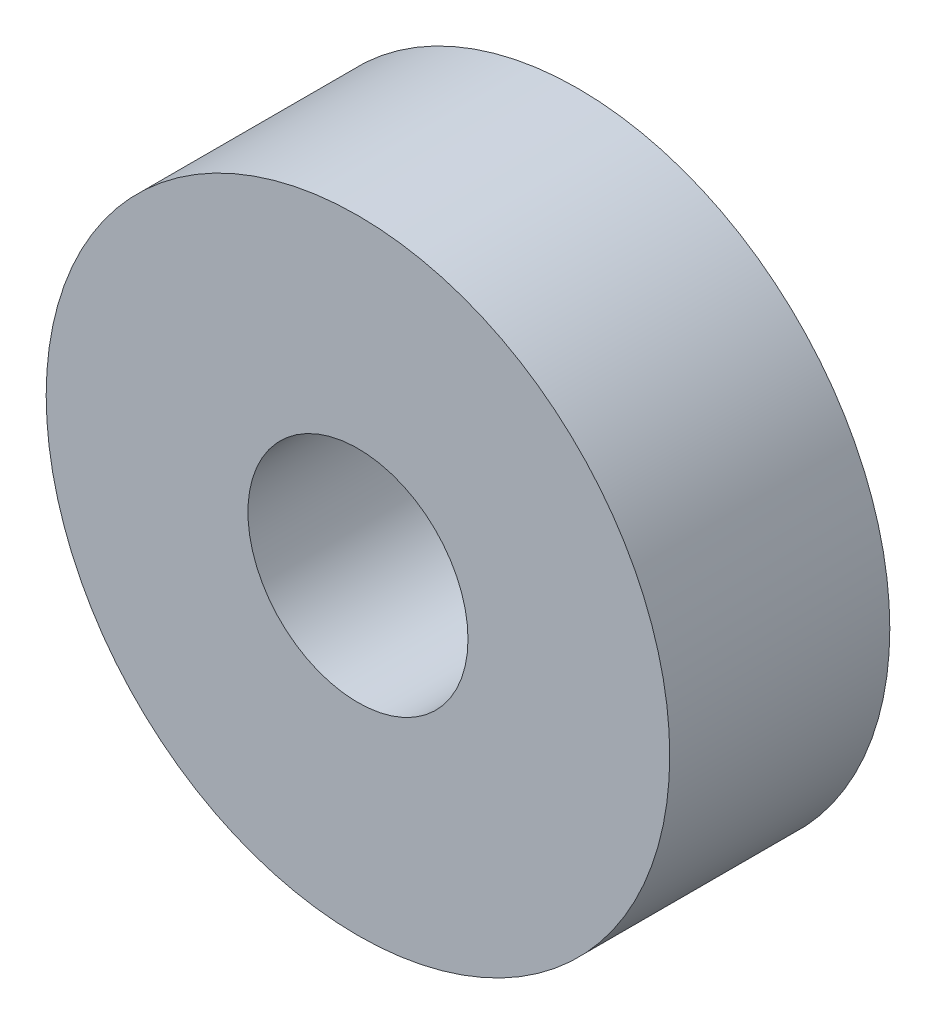
ISO-10303-21;
HEADER;
FILE_DESCRIPTION(('STEP AP214'),'2;1');
FILE_NAME('part.step','',(''),(''),'','','');
FILE_SCHEMA(('AUTOMOTIVE_DESIGN { 1 0 10303 214 1 1 1 1 }'));
ENDSEC;
DATA;
#1=APPLICATION_CONTEXT('core data for automotive mechanical design processes');
#2=APPLICATION_PROTOCOL_DEFINITION('international standard','automotive_design',2000,#1);
#3=PRODUCT_CONTEXT('',#1,'mechanical');
#4=PRODUCT('Part','Part','',(#3));
#5=PRODUCT_RELATED_PRODUCT_CATEGORY('part','',(#4));
#6=PRODUCT_DEFINITION_FORMATION('','',#4);
#7=PRODUCT_DEFINITION_CONTEXT('part definition',#1,'design');
#8=PRODUCT_DEFINITION('design','',#6,#7);
#9=PRODUCT_DEFINITION_SHAPE('','',#8);
#10=(LENGTH_UNIT() NAMED_UNIT(*) SI_UNIT(.MILLI.,.METRE.));
#11=(NAMED_UNIT(*) PLANE_ANGLE_UNIT() SI_UNIT($,.RADIAN.));
#12=(NAMED_UNIT(*) SI_UNIT($,.STERADIAN.) SOLID_ANGLE_UNIT());
#13=UNCERTAINTY_MEASURE_WITH_UNIT(LENGTH_MEASURE(1.E-05),#10,'distance_accuracy_value','');
#14=(GEOMETRIC_REPRESENTATION_CONTEXT(3) GLOBAL_UNCERTAINTY_ASSIGNED_CONTEXT((#13)) GLOBAL_UNIT_ASSIGNED_CONTEXT((#10,
#11,#12)) REPRESENTATION_CONTEXT('',''));
#15=CARTESIAN_POINT('',(0.,0.,0.));
#16=DIRECTION('',(0.,0.,1.));
#17=DIRECTION('',(1.,0.,0.));
#18=AXIS2_PLACEMENT_3D('',#15,#16,#17);
#19=CARTESIAN_POINT('',(0.,0.,3.));
#20=DIRECTION('',(0.,0.,1.));
#21=DIRECTION('',(1.,0.,0.));
#22=AXIS2_PLACEMENT_3D('',#19,#20,#21);
#23=PLANE('',#22);
#24=CARTESIAN_POINT('',(0.,0.,3.));
#25=DIRECTION('',(0.,0.,1.));
#26=DIRECTION('',(1.,0.,0.));
#27=AXIS2_PLACEMENT_3D('',#24,#25,#26);
#28=CIRCLE('',#27,8.5);
#29=CARTESIAN_POINT('',(8.5,0.,3.));
#30=VERTEX_POINT('',#29);
#31=EDGE_CURVE('E10',#30,#30,#28,.T.);
#32=ORIENTED_EDGE('',*,*,#31,.T.);
#33=EDGE_LOOP('',(#32));
#34=FACE_BOUND('',#33,.T.);
#35=CARTESIAN_POINT('',(0.,0.,3.));
#36=DIRECTION('',(0.,0.,1.));
#37=DIRECTION('',(1.,0.,0.));
#38=AXIS2_PLACEMENT_3D('',#35,#36,#37);
#39=CIRCLE('',#38,3.);
#40=CARTESIAN_POINT('',(3.,0.,3.));
#41=VERTEX_POINT('',#40);
#42=EDGE_CURVE('E45',#41,#41,#39,.T.);
#43=ORIENTED_EDGE('',*,*,#42,.F.);
#44=EDGE_LOOP('',(#43));
#45=FACE_BOUND('',#44,.T.);
#46=ADVANCED_FACE('F34',(#34,#45),#23,.T.);
#47=CARTESIAN_POINT('',(0.,0.,-3.));
#48=DIRECTION('',(0.,0.,1.));
#49=DIRECTION('',(1.,0.,0.));
#50=AXIS2_PLACEMENT_3D('',#47,#48,#49);
#51=PLANE('',#50);
#52=CARTESIAN_POINT('',(0.,0.,-3.));
#53=DIRECTION('',(0.,0.,1.));
#54=DIRECTION('',(1.,0.,0.));
#55=AXIS2_PLACEMENT_3D('',#52,#53,#54);
#56=CIRCLE('',#55,8.5);
#57=CARTESIAN_POINT('',(8.5,0.,-3.));
#58=VERTEX_POINT('',#57);
#59=EDGE_CURVE('E38',#58,#58,#56,.T.);
#60=ORIENTED_EDGE('',*,*,#59,.F.);
#61=EDGE_LOOP('',(#60));
#62=FACE_BOUND('',#61,.T.);
#63=CARTESIAN_POINT('',(0.,0.,-3.));
#64=DIRECTION('',(0.,0.,1.));
#65=DIRECTION('',(1.,0.,0.));
#66=AXIS2_PLACEMENT_3D('',#63,#64,#65);
#67=CIRCLE('',#66,3.);
#68=CARTESIAN_POINT('',(3.,0.,-3.));
#69=VERTEX_POINT('',#68);
#70=EDGE_CURVE('E47',#69,#69,#67,.T.);
#71=ORIENTED_EDGE('',*,*,#70,.T.);
#72=EDGE_LOOP('',(#71));
#73=FACE_BOUND('',#72,.T.);
#74=ADVANCED_FACE('F57',(#62,#73),#51,.F.);
#75=CARTESIAN_POINT('',(0.,0.,3.));
#76=DIRECTION('',(0.,0.,-1.));
#77=DIRECTION('',(-1.,0.,0.));
#78=AXIS2_PLACEMENT_3D('',#75,#76,#77);
#79=CYLINDRICAL_SURFACE('',#78,8.5);
#80=ORIENTED_EDGE('',*,*,#31,.F.);
#81=EDGE_LOOP('',(#80));
#82=FACE_BOUND('',#81,.T.);
#83=ORIENTED_EDGE('',*,*,#59,.T.);
#84=EDGE_LOOP('',(#83));
#85=FACE_BOUND('',#84,.T.);
#86=ADVANCED_FACE('F36',(#82,#85),#79,.T.);
#87=CARTESIAN_POINT('',(0.,0.,3.));
#88=DIRECTION('',(0.,0.,-1.));
#89=DIRECTION('',(-1.,0.,0.));
#90=AXIS2_PLACEMENT_3D('',#87,#88,#89);
#91=CYLINDRICAL_SURFACE('',#90,3.);
#92=ORIENTED_EDGE('',*,*,#42,.T.);
#93=EDGE_LOOP('',(#92));
#94=FACE_BOUND('',#93,.T.);
#95=ORIENTED_EDGE('',*,*,#70,.F.);
#96=EDGE_LOOP('',(#95));
#97=FACE_BOUND('',#96,.T.);
#98=ADVANCED_FACE('F53',(#94,#97),#91,.F.);
#99=CLOSED_SHELL('',(#46,#74,#86,#98));
#100=MANIFOLD_SOLID_BREP('B2',#99);
#101=ADVANCED_BREP_SHAPE_REPRESENTATION('',(#18,#100),#14);
#102=SHAPE_DEFINITION_REPRESENTATION(#9,#101);
ENDSEC;
END-ISO-10303-21;
